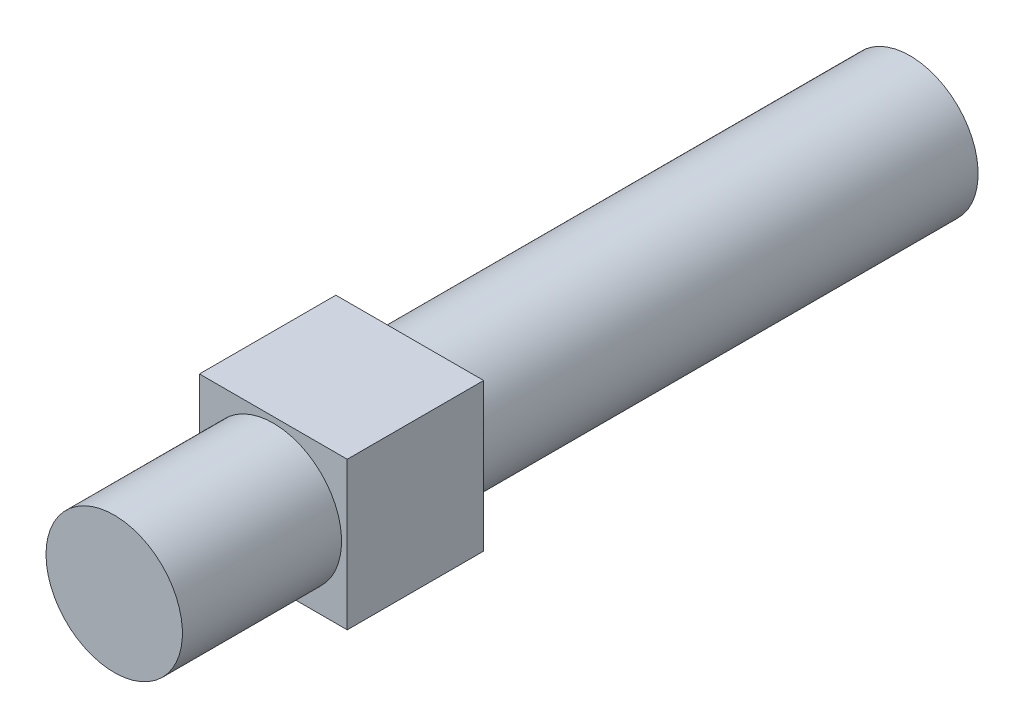
ISO-10303-21;
HEADER;
FILE_DESCRIPTION(('STEP AP214'),'2;1');
FILE_NAME('part.step','',(''),(''),'','','');
FILE_SCHEMA(('AUTOMOTIVE_DESIGN { 1 0 10303 214 1 1 1 1 }'));
ENDSEC;
DATA;
#1=APPLICATION_CONTEXT('core data for automotive mechanical design processes');
#2=APPLICATION_PROTOCOL_DEFINITION('international standard','automotive_design',2000,#1);
#3=PRODUCT_CONTEXT('',#1,'mechanical');
#4=PRODUCT('Part','Part','',(#3));
#5=PRODUCT_RELATED_PRODUCT_CATEGORY('part','',(#4));
#6=PRODUCT_DEFINITION_FORMATION('','',#4);
#7=PRODUCT_DEFINITION_CONTEXT('part definition',#1,'design');
#8=PRODUCT_DEFINITION('design','',#6,#7);
#9=PRODUCT_DEFINITION_SHAPE('','',#8);
#10=(LENGTH_UNIT() NAMED_UNIT(*) SI_UNIT(.MILLI.,.METRE.));
#11=(NAMED_UNIT(*) PLANE_ANGLE_UNIT() SI_UNIT($,.RADIAN.));
#12=(NAMED_UNIT(*) SI_UNIT($,.STERADIAN.) SOLID_ANGLE_UNIT());
#13=UNCERTAINTY_MEASURE_WITH_UNIT(LENGTH_MEASURE(1.E-05),#10,'distance_accuracy_value','');
#14=(GEOMETRIC_REPRESENTATION_CONTEXT(3) GLOBAL_UNCERTAINTY_ASSIGNED_CONTEXT((#13)) GLOBAL_UNIT_ASSIGNED_CONTEXT((#10,
#11,#12)) REPRESENTATION_CONTEXT('',''));
#15=CARTESIAN_POINT('',(0.,0.,0.));
#16=DIRECTION('',(0.,0.,1.));
#17=DIRECTION('',(1.,0.,0.));
#18=AXIS2_PLACEMENT_3D('',#15,#16,#17);
#19=CARTESIAN_POINT('',(0.,0.,-75.2136345866983));
#20=DIRECTION('',(0.,0.,-1.));
#21=DIRECTION('',(-1.,0.,0.));
#22=AXIS2_PLACEMENT_3D('',#19,#20,#21);
#23=CYLINDRICAL_SURFACE('',#22,6.);
#24=CARTESIAN_POINT('',(0.,0.,-26.));
#25=DIRECTION('',(0.,0.,-1.));
#26=DIRECTION('',(-1.,0.,0.));
#27=AXIS2_PLACEMENT_3D('',#24,#25,#26);
#28=CIRCLE('',#27,6.);
#29=CARTESIAN_POINT('',(-6.,0.,-26.));
#30=VERTEX_POINT('',#29);
#31=EDGE_CURVE('E45',#30,#30,#28,.T.);
#32=ORIENTED_EDGE('',*,*,#31,.T.);
#33=EDGE_LOOP('',(#32));
#34=FACE_BOUND('',#33,.T.);
#35=CARTESIAN_POINT('',(0.,0.,-70.));
#36=DIRECTION('',(0.,0.,-1.));
#37=DIRECTION('',(-1.,0.,0.));
#38=AXIS2_PLACEMENT_3D('',#35,#36,#37);
#39=CIRCLE('',#38,6.);
#40=CARTESIAN_POINT('',(-6.,0.,-70.));
#41=VERTEX_POINT('',#40);
#42=EDGE_CURVE('E121',#41,#41,#39,.T.);
#43=ORIENTED_EDGE('',*,*,#42,.F.);
#44=EDGE_LOOP('',(#43));
#45=FACE_BOUND('',#44,.T.);
#46=ADVANCED_FACE('F41',(#34,#45),#23,.T.);
#47=CARTESIAN_POINT('',(6.,0.,-70.));
#48=DIRECTION('',(0.,0.,1.));
#49=DIRECTION('',(1.,0.,0.));
#50=AXIS2_PLACEMENT_3D('',#47,#48,#49);
#51=PLANE('',#50);
#52=ORIENTED_EDGE('',*,*,#42,.T.);
#53=EDGE_LOOP('',(#52));
#54=FACE_BOUND('',#53,.T.);
#55=ADVANCED_FACE('F139',(#54),#51,.F.);
#56=CARTESIAN_POINT('',(-6.5,6.5,-26.));
#57=DIRECTION('',(-1.,0.,0.));
#58=DIRECTION('',(0.,-1.,0.));
#59=AXIS2_PLACEMENT_3D('',#56,#57,#58);
#60=PLANE('',#59);
#61=DIRECTION('',(0.,-1.,0.));
#62=VECTOR('',#61,1.);
#63=CARTESIAN_POINT('',(-6.5,6.5,-14.));
#64=LINE('',#63,#62);
#65=CARTESIAN_POINT('',(-6.5,6.5,-14.));
#66=VERTEX_POINT('',#65);
#67=CARTESIAN_POINT('',(-6.5,-6.5,-14.));
#68=VERTEX_POINT('',#67);
#69=EDGE_CURVE('E110',#66,#68,#64,.T.);
#70=ORIENTED_EDGE('',*,*,#69,.F.);
#71=DIRECTION('',(0.,0.,1.));
#72=VECTOR('',#71,1.);
#73=CARTESIAN_POINT('',(-6.5,6.5,-26.));
#74=LINE('',#73,#72);
#75=CARTESIAN_POINT('',(-6.5,6.5,-26.));
#76=VERTEX_POINT('',#75);
#77=EDGE_CURVE('E59',#76,#66,#74,.T.);
#78=ORIENTED_EDGE('',*,*,#77,.F.);
#79=DIRECTION('',(0.,-1.,0.));
#80=VECTOR('',#79,1.);
#81=CARTESIAN_POINT('',(-6.5,6.5,-26.));
#82=LINE('',#81,#80);
#83=CARTESIAN_POINT('',(-6.5,-6.5,-26.));
#84=VERTEX_POINT('',#83);
#85=EDGE_CURVE('E104',#76,#84,#82,.T.);
#86=ORIENTED_EDGE('',*,*,#85,.T.);
#87=DIRECTION('',(0.,0.,1.));
#88=VECTOR('',#87,1.);
#89=CARTESIAN_POINT('',(-6.5,-6.5,-26.));
#90=LINE('',#89,#88);
#91=EDGE_CURVE('E87',#84,#68,#90,.T.);
#92=ORIENTED_EDGE('',*,*,#91,.T.);
#93=EDGE_LOOP('',(#70,#78,#86,#92));
#94=FACE_BOUND('',#93,.T.);
#95=ADVANCED_FACE('F144',(#94),#60,.T.);
#96=CARTESIAN_POINT('',(6.5,6.5,-26.));
#97=DIRECTION('',(0.,1.,0.));
#98=DIRECTION('',(-1.,0.,0.));
#99=AXIS2_PLACEMENT_3D('',#96,#97,#98);
#100=PLANE('',#99);
#101=DIRECTION('',(-1.,0.,0.));
#102=VECTOR('',#101,1.);
#103=CARTESIAN_POINT('',(6.5,6.5,-14.));
#104=LINE('',#103,#102);
#105=CARTESIAN_POINT('',(6.5,6.5,-14.));
#106=VERTEX_POINT('',#105);
#107=EDGE_CURVE('E106',#106,#66,#104,.T.);
#108=ORIENTED_EDGE('',*,*,#107,.F.);
#109=DIRECTION('',(0.,0.,1.));
#110=VECTOR('',#109,1.);
#111=CARTESIAN_POINT('',(6.5,6.5,-26.));
#112=LINE('',#111,#110);
#113=CARTESIAN_POINT('',(6.5,6.5,-26.));
#114=VERTEX_POINT('',#113);
#115=EDGE_CURVE('E76',#114,#106,#112,.T.);
#116=ORIENTED_EDGE('',*,*,#115,.F.);
#117=DIRECTION('',(-1.,0.,0.));
#118=VECTOR('',#117,1.);
#119=CARTESIAN_POINT('',(6.5,6.5,-26.));
#120=LINE('',#119,#118);
#121=EDGE_CURVE('E101',#114,#76,#120,.T.);
#122=ORIENTED_EDGE('',*,*,#121,.T.);
#123=ORIENTED_EDGE('',*,*,#77,.T.);
#124=EDGE_LOOP('',(#108,#116,#122,#123));
#125=FACE_BOUND('',#124,.T.);
#126=ADVANCED_FACE('F152',(#125),#100,.T.);
#127=CARTESIAN_POINT('',(6.5,6.5,-26.));
#128=DIRECTION('',(1.,0.,0.));
#129=DIRECTION('',(0.,1.,0.));
#130=AXIS2_PLACEMENT_3D('',#127,#128,#129);
#131=PLANE('',#130);
#132=DIRECTION('',(0.,1.,0.));
#133=VECTOR('',#132,1.);
#134=CARTESIAN_POINT('',(6.5,6.5,-14.));
#135=LINE('',#134,#133);
#136=CARTESIAN_POINT('',(6.5,-6.5,-14.));
#137=VERTEX_POINT('',#136);
#138=EDGE_CURVE('E95',#137,#106,#135,.T.);
#139=ORIENTED_EDGE('',*,*,#138,.F.);
#140=DIRECTION('',(0.,0.,1.));
#141=VECTOR('',#140,1.);
#142=CARTESIAN_POINT('',(6.5,-6.5,-26.));
#143=LINE('',#142,#141);
#144=CARTESIAN_POINT('',(6.5,-6.5,-26.));
#145=VERTEX_POINT('',#144);
#146=EDGE_CURVE('E90',#145,#137,#143,.T.);
#147=ORIENTED_EDGE('',*,*,#146,.F.);
#148=DIRECTION('',(0.,1.,0.));
#149=VECTOR('',#148,1.);
#150=CARTESIAN_POINT('',(6.5,6.5,-26.));
#151=LINE('',#150,#149);
#152=EDGE_CURVE('E93',#145,#114,#151,.T.);
#153=ORIENTED_EDGE('',*,*,#152,.T.);
#154=ORIENTED_EDGE('',*,*,#115,.T.);
#155=EDGE_LOOP('',(#139,#147,#153,#154));
#156=FACE_BOUND('',#155,.T.);
#157=ADVANCED_FACE('F92',(#156),#131,.T.);
#158=CARTESIAN_POINT('',(6.5,-6.5,-26.));
#159=DIRECTION('',(0.,-1.,0.));
#160=DIRECTION('',(1.,0.,0.));
#161=AXIS2_PLACEMENT_3D('',#158,#159,#160);
#162=PLANE('',#161);
#163=DIRECTION('',(1.,0.,0.));
#164=VECTOR('',#163,1.);
#165=CARTESIAN_POINT('',(6.5,-6.5,-14.));
#166=LINE('',#165,#164);
#167=EDGE_CURVE('E113',#68,#137,#166,.T.);
#168=ORIENTED_EDGE('',*,*,#167,.F.);
#169=ORIENTED_EDGE('',*,*,#91,.F.);
#170=DIRECTION('',(1.,0.,0.));
#171=VECTOR('',#170,1.);
#172=CARTESIAN_POINT('',(6.5,-6.5,-26.));
#173=LINE('',#172,#171);
#174=EDGE_CURVE('E100',#84,#145,#173,.T.);
#175=ORIENTED_EDGE('',*,*,#174,.T.);
#176=ORIENTED_EDGE('',*,*,#146,.T.);
#177=EDGE_LOOP('',(#168,#169,#175,#176));
#178=FACE_BOUND('',#177,.T.);
#179=ADVANCED_FACE('F103',(#178),#162,.T.);
#180=CARTESIAN_POINT('',(0.,0.,-26.));
#181=DIRECTION('',(0.,0.,-1.));
#182=DIRECTION('',(-1.,0.,0.));
#183=AXIS2_PLACEMENT_3D('',#180,#181,#182);
#184=PLANE('',#183);
#185=ORIENTED_EDGE('',*,*,#31,.F.);
#186=EDGE_LOOP('',(#185));
#187=FACE_BOUND('',#186,.T.);
#188=ORIENTED_EDGE('',*,*,#85,.F.);
#189=ORIENTED_EDGE('',*,*,#121,.F.);
#190=ORIENTED_EDGE('',*,*,#152,.F.);
#191=ORIENTED_EDGE('',*,*,#174,.F.);
#192=EDGE_LOOP('',(#188,#189,#190,#191));
#193=FACE_BOUND('',#192,.T.);
#194=ADVANCED_FACE('F99',(#187,#193),#184,.T.);
#195=CARTESIAN_POINT('',(0.,0.,-14.));
#196=DIRECTION('',(0.,0.,-1.));
#197=DIRECTION('',(-1.,0.,0.));
#198=AXIS2_PLACEMENT_3D('',#195,#196,#197);
#199=PLANE('',#198);
#200=CARTESIAN_POINT('',(0.,0.,-14.));
#201=DIRECTION('',(0.,0.,-1.));
#202=DIRECTION('',(-1.,0.,0.));
#203=AXIS2_PLACEMENT_3D('',#200,#201,#202);
#204=CIRCLE('',#203,6.);
#205=CARTESIAN_POINT('',(-6.,0.,-14.));
#206=VERTEX_POINT('',#205);
#207=EDGE_CURVE('E11',#206,#206,#204,.T.);
#208=ORIENTED_EDGE('',*,*,#207,.T.);
#209=EDGE_LOOP('',(#208));
#210=FACE_BOUND('',#209,.T.);
#211=ORIENTED_EDGE('',*,*,#69,.T.);
#212=ORIENTED_EDGE('',*,*,#167,.T.);
#213=ORIENTED_EDGE('',*,*,#138,.T.);
#214=ORIENTED_EDGE('',*,*,#107,.T.);
#215=EDGE_LOOP('',(#211,#212,#213,#214));
#216=FACE_BOUND('',#215,.T.);
#217=ADVANCED_FACE('F131',(#210,#216),#199,.F.);
#218=CARTESIAN_POINT('',(0.,0.,0.));
#219=DIRECTION('',(0.,0.,-1.));
#220=DIRECTION('',(-1.,0.,0.));
#221=AXIS2_PLACEMENT_3D('',#218,#219,#220);
#222=PLANE('',#221);
#223=CARTESIAN_POINT('',(0.,0.,0.));
#224=DIRECTION('',(0.,0.,-1.));
#225=DIRECTION('',(-1.,0.,0.));
#226=AXIS2_PLACEMENT_3D('',#223,#224,#225);
#227=CIRCLE('',#226,6.);
#228=CARTESIAN_POINT('',(-6.,0.,0.));
#229=VERTEX_POINT('',#228);
#230=EDGE_CURVE('E51',#229,#229,#227,.T.);
#231=ORIENTED_EDGE('',*,*,#230,.F.);
#232=EDGE_LOOP('',(#231));
#233=FACE_BOUND('',#232,.T.);
#234=ADVANCED_FACE('F43',(#233),#222,.F.);
#235=ORIENTED_EDGE('',*,*,#230,.T.);
#236=EDGE_LOOP('',(#235));
#237=FACE_BOUND('',#236,.T.);
#238=ORIENTED_EDGE('',*,*,#207,.F.);
#239=EDGE_LOOP('',(#238));
#240=FACE_BOUND('',#239,.T.);
#241=ADVANCED_FACE('F127',(#237,#240),#23,.T.);
#242=CLOSED_SHELL('',(#46,#55,#95,#126,#157,#179,#194,#217,#234,#241));
#243=MANIFOLD_SOLID_BREP('B2',#242);
#244=ADVANCED_BREP_SHAPE_REPRESENTATION('',(#18,#243),#14);
#245=SHAPE_DEFINITION_REPRESENTATION(#9,#244);
ENDSEC;
END-ISO-10303-21;
